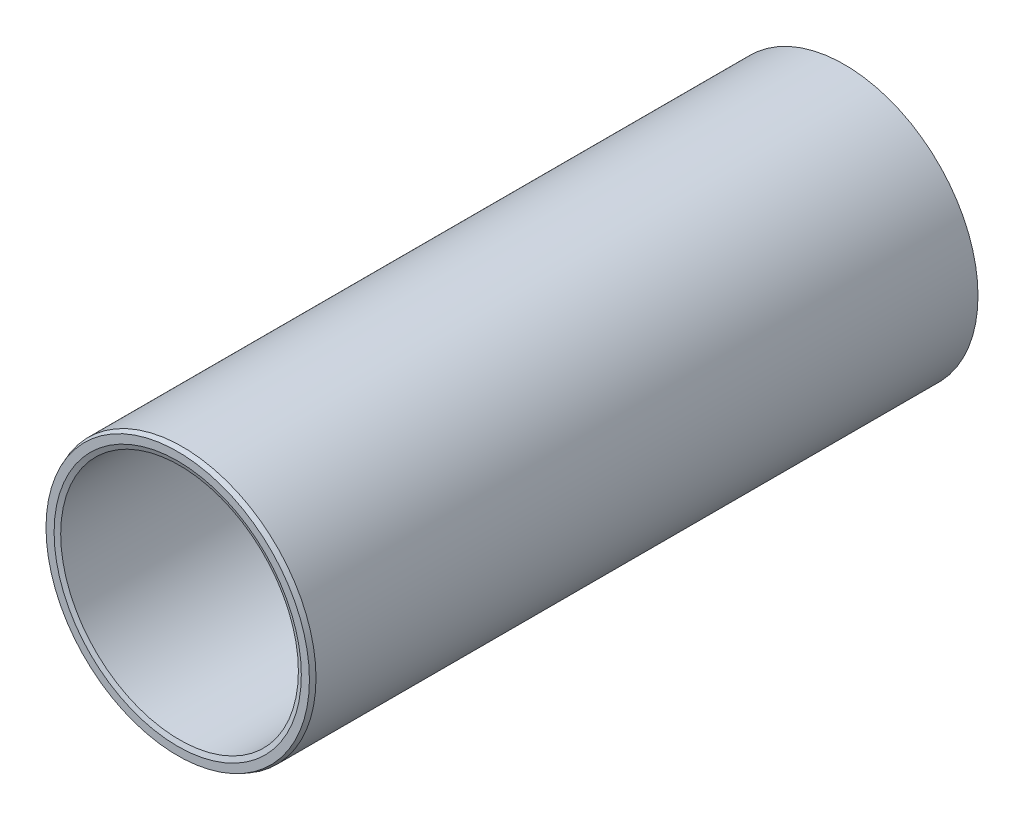
ISO-10303-21;
HEADER;
FILE_DESCRIPTION(('STEP AP214'),'2;1');
FILE_NAME('part.step','',(''),(''),'','','');
FILE_SCHEMA(('AUTOMOTIVE_DESIGN { 1 0 10303 214 1 1 1 1 }'));
ENDSEC;
DATA;
#1=APPLICATION_CONTEXT('core data for automotive mechanical design processes');
#2=APPLICATION_PROTOCOL_DEFINITION('international standard','automotive_design',2000,#1);
#3=PRODUCT_CONTEXT('',#1,'mechanical');
#4=PRODUCT('Part','Part','',(#3));
#5=PRODUCT_RELATED_PRODUCT_CATEGORY('part','',(#4));
#6=PRODUCT_DEFINITION_FORMATION('','',#4);
#7=PRODUCT_DEFINITION_CONTEXT('part definition',#1,'design');
#8=PRODUCT_DEFINITION('design','',#6,#7);
#9=PRODUCT_DEFINITION_SHAPE('','',#8);
#10=(LENGTH_UNIT() NAMED_UNIT(*) SI_UNIT(.MILLI.,.METRE.));
#11=(NAMED_UNIT(*) PLANE_ANGLE_UNIT() SI_UNIT($,.RADIAN.));
#12=(NAMED_UNIT(*) SI_UNIT($,.STERADIAN.) SOLID_ANGLE_UNIT());
#13=UNCERTAINTY_MEASURE_WITH_UNIT(LENGTH_MEASURE(1.E-05),#10,'distance_accuracy_value','');
#14=(GEOMETRIC_REPRESENTATION_CONTEXT(3) GLOBAL_UNCERTAINTY_ASSIGNED_CONTEXT((#13)) GLOBAL_UNIT_ASSIGNED_CONTEXT((#10,
#11,#12)) REPRESENTATION_CONTEXT('',''));
#15=CARTESIAN_POINT('',(0.,0.,0.));
#16=DIRECTION('',(0.,0.,1.));
#17=DIRECTION('',(1.,0.,0.));
#18=AXIS2_PLACEMENT_3D('',#15,#16,#17);
#19=CARTESIAN_POINT('',(0.,0.,5.625));
#20=DIRECTION('',(0.,0.,1.));
#21=DIRECTION('',(1.,0.,0.));
#22=AXIS2_PLACEMENT_3D('',#19,#20,#21);
#23=PLANE('',#22);
#24=CARTESIAN_POINT('',(0.,0.,5.625));
#25=DIRECTION('',(0.,0.,1.));
#26=DIRECTION('',(1.,0.,0.));
#27=AXIS2_PLACEMENT_3D('',#24,#25,#26);
#28=CIRCLE('',#27,1.10814543859859);
#29=CARTESIAN_POINT('',(1.10814543859859,0.,5.625));
#30=VERTEX_POINT('',#29);
#31=EDGE_CURVE('E10',#30,#30,#28,.T.);
#32=ORIENTED_EDGE('',*,*,#31,.T.);
#33=EDGE_LOOP('',(#32));
#34=FACE_BOUND('',#33,.T.);
#35=CARTESIAN_POINT('',(0.,0.,5.625));
#36=DIRECTION('',(0.,0.,1.));
#37=DIRECTION('',(1.,0.,0.));
#38=AXIS2_PLACEMENT_3D('',#35,#36,#37);
#39=CIRCLE('',#38,1.04);
#40=CARTESIAN_POINT('',(1.04,0.,5.625));
#41=VERTEX_POINT('',#40);
#42=EDGE_CURVE('E38',#41,#41,#39,.F.);
#43=ORIENTED_EDGE('',*,*,#42,.T.);
#44=EDGE_LOOP('',(#43));
#45=FACE_BOUND('',#44,.T.);
#46=ADVANCED_FACE('F31',(#34,#45),#23,.T.);
#47=CARTESIAN_POINT('',(0.,0.,0.));
#48=DIRECTION('',(0.,0.,1.));
#49=DIRECTION('',(1.,0.,0.));
#50=AXIS2_PLACEMENT_3D('',#47,#48,#49);
#51=PLANE('',#50);
#52=CARTESIAN_POINT('',(0.,0.,0.));
#53=DIRECTION('',(0.,0.,1.));
#54=DIRECTION('',(1.,0.,0.));
#55=AXIS2_PLACEMENT_3D('',#52,#53,#54);
#56=CIRCLE('',#55,1.0835);
#57=CARTESIAN_POINT('',(1.0835,0.,0.));
#58=VERTEX_POINT('',#57);
#59=EDGE_CURVE('E51',#58,#58,#56,.F.);
#60=ORIENTED_EDGE('',*,*,#59,.T.);
#61=EDGE_LOOP('',(#60));
#62=FACE_BOUND('',#61,.T.);
#63=CARTESIAN_POINT('',(0.,0.,0.));
#64=DIRECTION('',(0.,0.,1.));
#65=DIRECTION('',(1.,0.,0.));
#66=AXIS2_PLACEMENT_3D('',#63,#64,#65);
#67=CIRCLE('',#66,1.01535456140142);
#68=CARTESIAN_POINT('',(1.01535456140142,0.,0.));
#69=VERTEX_POINT('',#68);
#70=EDGE_CURVE('E54',#69,#69,#67,.T.);
#71=ORIENTED_EDGE('',*,*,#70,.T.);
#72=EDGE_LOOP('',(#71));
#73=FACE_BOUND('',#72,.T.);
#74=ADVANCED_FACE('F79',(#62,#73),#51,.F.);
#75=CARTESIAN_POINT('',(0.,0.,5.625));
#76=DIRECTION('',(0.,0.,-1.));
#77=DIRECTION('',(-1.,0.,0.));
#78=AXIS2_PLACEMENT_3D('',#75,#76,#77);
#79=CYLINDRICAL_SURFACE('',#78,1.1235);
#80=CARTESIAN_POINT('',(0.,0.,0.0153545614014171));
#81=DIRECTION('',(0.,0.,1.));
#82=DIRECTION('',(1.,0.,0.));
#83=AXIS2_PLACEMENT_3D('',#80,#81,#82);
#84=CIRCLE('',#83,1.1235);
#85=CARTESIAN_POINT('',(-1.1235,0.,0.0153545614014162));
#86=VERTEX_POINT('',#85);
#87=EDGE_CURVE('E57',#86,#86,#84,.T.);
#88=CARTESIAN_POINT('',(0.,0.,5.58500000000002));
#89=DIRECTION('',(0.,0.,1.));
#90=DIRECTION('',(1.,0.,0.));
#91=AXIS2_PLACEMENT_3D('',#88,#89,#90);
#92=CIRCLE('',#91,1.1235);
#93=CARTESIAN_POINT('',(-1.1235,0.,5.58500000000001));
#94=VERTEX_POINT('',#93);
#95=EDGE_CURVE('E60',#94,#94,#92,.F.);
#96=CARTESIAN_POINT('',(-1.1235,0.,0.0153545614014162));
#97=CARTESIAN_POINT('',(-1.1235,0.,0.0733717013868181));
#98=CARTESIAN_POINT('',(-1.1235,0.,0.13138884137222));
#99=CARTESIAN_POINT('',(-1.1235,0.,0.247423121343024));
#100=CARTESIAN_POINT('',(-1.1235,0.,0.305440261328426));
#101=CARTESIAN_POINT('',(-1.1235,0.,0.421474541299231));
#102=CARTESIAN_POINT('',(-1.1235,0.,0.479491681284633));
#103=CARTESIAN_POINT('',(-1.1235,0.,0.595525961255437));
#104=CARTESIAN_POINT('',(-1.1235,0.,0.653543101240839));
#105=CARTESIAN_POINT('',(-1.1235,0.,0.769577381211643));
#106=CARTESIAN_POINT('',(-1.1235,0.,0.827594521197045));
#107=CARTESIAN_POINT('',(-1.1235,0.,0.943628801167849));
#108=CARTESIAN_POINT('',(-1.1235,0.,1.00164594115325));
#109=CARTESIAN_POINT('',(-1.1235,0.,1.11768022112406));
#110=CARTESIAN_POINT('',(-1.1235,0.,1.17569736110946));
#111=CARTESIAN_POINT('',(-1.1235,0.,1.29173164108026));
#112=CARTESIAN_POINT('',(-1.1235,0.,1.34974878106566));
#113=CARTESIAN_POINT('',(-1.1235,0.,1.46578306103647));
#114=CARTESIAN_POINT('',(-1.1235,0.,1.52380020102187));
#115=CARTESIAN_POINT('',(-1.1235,0.,1.63983448099267));
#116=CARTESIAN_POINT('',(-1.1235,0.,1.69785162097808));
#117=CARTESIAN_POINT('',(-1.1235,0.,1.81388590094888));
#118=CARTESIAN_POINT('',(-1.1235,0.,1.87190304093428));
#119=CARTESIAN_POINT('',(-1.1235,0.,1.98793732090509));
#120=CARTESIAN_POINT('',(-1.1235,0.,2.04595446089049));
#121=CARTESIAN_POINT('',(-1.1235,0.,2.16198874086129));
#122=CARTESIAN_POINT('',(-1.1235,0.,2.22000588084669));
#123=CARTESIAN_POINT('',(-1.1235,0.,2.3360401608175));
#124=CARTESIAN_POINT('',(-1.1235,0.,2.3940573008029));
#125=CARTESIAN_POINT('',(-1.1235,0.,2.51009158077371));
#126=CARTESIAN_POINT('',(-1.1235,0.,2.56810872075911));
#127=CARTESIAN_POINT('',(-1.1235,0.,2.68414300072991));
#128=CARTESIAN_POINT('',(-1.1235,0.,2.74216014071531));
#129=CARTESIAN_POINT('',(-1.1235,0.,2.85819442068612));
#130=CARTESIAN_POINT('',(-1.1235,0.,2.91621156067152));
#131=CARTESIAN_POINT('',(-1.1235,0.,3.03224584064232));
#132=CARTESIAN_POINT('',(-1.1235,0.,3.09026298062773));
#133=CARTESIAN_POINT('',(-1.1235,0.,3.20629726059853));
#134=CARTESIAN_POINT('',(-1.1235,0.,3.26431440058393));
#135=CARTESIAN_POINT('',(-1.1235,0.,3.38034868055474));
#136=CARTESIAN_POINT('',(-1.1235,0.,3.43836582054014));
#137=CARTESIAN_POINT('',(-1.1235,0.,3.55440010051094));
#138=CARTESIAN_POINT('',(-1.1235,0.,3.61241724049634));
#139=CARTESIAN_POINT('',(-1.1235,0.,3.72845152046715));
#140=CARTESIAN_POINT('',(-1.1235,0.,3.78646866045255));
#141=CARTESIAN_POINT('',(-1.1235,0.,3.90250294042335));
#142=CARTESIAN_POINT('',(-1.1235,0.,3.96052008040876));
#143=CARTESIAN_POINT('',(-1.1235,0.,4.07655436037956));
#144=CARTESIAN_POINT('',(-1.1235,0.,4.13457150036496));
#145=CARTESIAN_POINT('',(-1.1235,0.,4.25060578033577));
#146=CARTESIAN_POINT('',(-1.1235,0.,4.30862292032117));
#147=CARTESIAN_POINT('',(-1.1235,0.,4.42465720029197));
#148=CARTESIAN_POINT('',(-1.1235,0.,4.48267434027737));
#149=CARTESIAN_POINT('',(-1.1235,0.,4.59870862024818));
#150=CARTESIAN_POINT('',(-1.1235,0.,4.65672576023358));
#151=CARTESIAN_POINT('',(-1.1235,0.,4.77276004020439));
#152=CARTESIAN_POINT('',(-1.1235,0.,4.83077718018979));
#153=CARTESIAN_POINT('',(-1.1235,0.,4.94681146016059));
#154=CARTESIAN_POINT('',(-1.1235,0.,5.00482860014599));
#155=CARTESIAN_POINT('',(-1.1235,0.,5.1208628801168));
#156=CARTESIAN_POINT('',(-1.1235,0.,5.1788800201022));
#157=CARTESIAN_POINT('',(-1.1235,0.,5.294914300073));
#158=CARTESIAN_POINT('',(-1.1235,0.,5.35293144005841));
#159=CARTESIAN_POINT('',(-1.1235,0.,5.46896572002921));
#160=CARTESIAN_POINT('',(-1.1235,0.,5.52698286001461));
#161=CARTESIAN_POINT('',(-1.1235,0.,5.58500000000001));
#162=B_SPLINE_CURVE_WITH_KNOTS('',3,(#96,#97,#98,#99,#100,#101,#102,#103,#104,#105,#106,#107,
#108,#109,#110,#111,#112,#113,#114,#115,#116,#117,#118,#119,#120,#121,#122,#123,#124,#125,#126,
#127,#128,#129,#130,#131,#132,#133,#134,#135,#136,#137,#138,#139,#140,#141,#142,#143,#144,#145,
#146,#147,#148,#149,#150,#151,#152,#153,#154,#155,#156,#157,#158,#159,#160,#161),.UNSPECIFIED.,
.F.,.F.,(4,2,2,2,2,2,2,2,2,2,2,2,2,2,2,2,2,2,2,2,2,2,2,2,2,2,2,2,2,2,2,2,4),(0.,
0.174051419956206,0.348102839912412,0.522154259868618,0.696205679824825,0.870257099781031,
1.04430851973724,1.21835993969344,1.39241135964965,1.56646277960586,1.74051419956206,
1.91456561951827,2.08861703947447,2.26266845943068,2.43671987938689,2.61077129934309,
2.7848227192993,2.95887413925551,3.13292555921171,3.30697697916792,3.48102839912412,
3.65507981908033,3.82913123903654,4.00318265899274,4.17723407894895,4.35128549890516,
4.52533691886136,4.69938833881757,4.87343975877377,5.04749117872998,5.22154259868619,
5.39559401864239,5.5696454385986),.UNSPECIFIED.);
#163=EDGE_CURVE('BSEAM64',#86,#94,#162,.T.);
#164=ORIENTED_EDGE('',*,*,#87,.T.);
#165=ORIENTED_EDGE('',*,*,#95,.T.);
#166=ORIENTED_EDGE('',*,*,#163,.T.);
#167=ORIENTED_EDGE('',*,*,#163,.F.);
#168=EDGE_LOOP('',(#164,#166,#165,#167));
#169=FACE_BOUND('',#168,.T.);
#170=ADVANCED_FACE('F64',(#169),#79,.T.);
#171=CARTESIAN_POINT('',(0.,0.,5.625));
#172=DIRECTION('',(0.,0.,-1.));
#173=DIRECTION('',(-1.,0.,0.));
#174=AXIS2_PLACEMENT_3D('',#171,#172,#173);
#175=CYLINDRICAL_SURFACE('',#174,1.);
#176=CARTESIAN_POINT('',(0.,0.,0.0400000000000001));
#177=DIRECTION('',(0.,0.,1.));
#178=DIRECTION('',(1.,0.,0.));
#179=AXIS2_PLACEMENT_3D('',#176,#177,#178);
#180=CIRCLE('',#179,1.);
#181=CARTESIAN_POINT('',(-1.,0.,0.0399999999999992));
#182=VERTEX_POINT('',#181);
#183=EDGE_CURVE('E42',#182,#182,#180,.F.);
#184=CARTESIAN_POINT('',(0.,0.,5.60964543859858));
#185=DIRECTION('',(0.,0.,1.));
#186=DIRECTION('',(1.,0.,0.));
#187=AXIS2_PLACEMENT_3D('',#184,#185,#186);
#188=CIRCLE('',#187,1.);
#189=CARTESIAN_POINT('',(-1.,0.,5.60964543859858));
#190=VERTEX_POINT('',#189);
#191=EDGE_CURVE('E46',#190,#190,#188,.T.);
#192=CARTESIAN_POINT('',(-1.,0.,0.0399999999999992));
#193=CARTESIAN_POINT('',(-1.,0.,0.0980171399854012));
#194=CARTESIAN_POINT('',(-1.,0.,0.156034279970803));
#195=CARTESIAN_POINT('',(-1.,0.,0.272068559941607));
#196=CARTESIAN_POINT('',(-1.,0.,0.330085699927009));
#197=CARTESIAN_POINT('',(-1.,0.,0.446119979897813));
#198=CARTESIAN_POINT('',(-1.,0.,0.504137119883215));
#199=CARTESIAN_POINT('',(-1.,0.,0.620171399854019));
#200=CARTESIAN_POINT('',(-1.,0.,0.678188539839421));
#201=CARTESIAN_POINT('',(-1.,0.,0.794222819810224));
#202=CARTESIAN_POINT('',(-1.,0.,0.852239959795626));
#203=CARTESIAN_POINT('',(-1.,0.,0.96827423976643));
#204=CARTESIAN_POINT('',(-1.,0.,1.02629137975183));
#205=CARTESIAN_POINT('',(-1.,0.,1.14232565972264));
#206=CARTESIAN_POINT('',(-1.,0.,1.20034279970804));
#207=CARTESIAN_POINT('',(-1.,0.,1.31637707967884));
#208=CARTESIAN_POINT('',(-1.,0.,1.37439421966424));
#209=CARTESIAN_POINT('',(-1.,0.,1.49042849963505));
#210=CARTESIAN_POINT('',(-1.,0.,1.54844563962045));
#211=CARTESIAN_POINT('',(-1.,0.,1.66447991959125));
#212=CARTESIAN_POINT('',(-1.,0.,1.72249705957665));
#213=CARTESIAN_POINT('',(-1.,0.,1.83853133954746));
#214=CARTESIAN_POINT('',(-1.,0.,1.89654847953286));
#215=CARTESIAN_POINT('',(-1.,0.,2.01258275950366));
#216=CARTESIAN_POINT('',(-1.,0.,2.07059989948907));
#217=CARTESIAN_POINT('',(-1.,0.,2.18663417945987));
#218=CARTESIAN_POINT('',(-1.,0.,2.24465131944527));
#219=CARTESIAN_POINT('',(-1.,0.,2.36068559941608));
#220=CARTESIAN_POINT('',(-1.,0.,2.41870273940148));
#221=CARTESIAN_POINT('',(-1.,0.,2.53473701937228));
#222=CARTESIAN_POINT('',(-1.,0.,2.59275415935768));
#223=CARTESIAN_POINT('',(-1.,0.,2.70878843932849));
#224=CARTESIAN_POINT('',(-1.,0.,2.76680557931389));
#225=CARTESIAN_POINT('',(-1.,0.,2.88283985928469));
#226=CARTESIAN_POINT('',(-1.,0.,2.94085699927009));
#227=CARTESIAN_POINT('',(-1.,0.,3.0568912792409));
#228=CARTESIAN_POINT('',(-1.,0.,3.1149084192263));
#229=CARTESIAN_POINT('',(-1.,0.,3.2309426991971));
#230=CARTESIAN_POINT('',(-1.,0.,3.28895983918251));
#231=CARTESIAN_POINT('',(-1.,0.,3.40499411915331));
#232=CARTESIAN_POINT('',(-1.,0.,3.46301125913871));
#233=CARTESIAN_POINT('',(-1.,0.,3.57904553910952));
#234=CARTESIAN_POINT('',(-1.,0.,3.63706267909492));
#235=CARTESIAN_POINT('',(-1.,0.,3.75309695906572));
#236=CARTESIAN_POINT('',(-1.,0.,3.81111409905112));
#237=CARTESIAN_POINT('',(-1.,0.,3.92714837902193));
#238=CARTESIAN_POINT('',(-1.,0.,3.98516551900733));
#239=CARTESIAN_POINT('',(-1.,0.,4.10119979897813));
#240=CARTESIAN_POINT('',(-1.,0.,4.15921693896353));
#241=CARTESIAN_POINT('',(-1.,0.,4.27525121893434));
#242=CARTESIAN_POINT('',(-1.,0.,4.33326835891974));
#243=CARTESIAN_POINT('',(-1.,0.,4.44930263889054));
#244=CARTESIAN_POINT('',(-1.,0.,4.50731977887595));
#245=CARTESIAN_POINT('',(-1.,0.,4.62335405884675));
#246=CARTESIAN_POINT('',(-1.,0.,4.68137119883215));
#247=CARTESIAN_POINT('',(-1.,0.,4.79740547880295));
#248=CARTESIAN_POINT('',(-1.,0.,4.85542261878836));
#249=CARTESIAN_POINT('',(-1.,0.,4.97145689875916));
#250=CARTESIAN_POINT('',(-1.,0.,5.02947403874456));
#251=CARTESIAN_POINT('',(-1.,0.,5.14550831871537));
#252=CARTESIAN_POINT('',(-1.,0.,5.20352545870077));
#253=CARTESIAN_POINT('',(-1.,0.,5.31955973867157));
#254=CARTESIAN_POINT('',(-1.,0.,5.37757687865697));
#255=CARTESIAN_POINT('',(-1.,0.,5.49361115862778));
#256=CARTESIAN_POINT('',(-1.,0.,5.55162829861318));
#257=CARTESIAN_POINT('',(-1.,0.,5.60964543859858));
#258=B_SPLINE_CURVE_WITH_KNOTS('',3,(#192,#193,#194,#195,#196,#197,#198,#199,#200,#201,#202,
#203,#204,#205,#206,#207,#208,#209,#210,#211,#212,#213,#214,#215,#216,#217,#218,#219,#220,#221,
#222,#223,#224,#225,#226,#227,#228,#229,#230,#231,#232,#233,#234,#235,#236,#237,#238,#239,#240,
#241,#242,#243,#244,#245,#246,#247,#248,#249,#250,#251,#252,#253,#254,#255,#256,#257),
.UNSPECIFIED.,.F.,.F.,(4,2,2,2,2,2,2,2,2,2,2,2,2,2,2,2,2,2,2,2,2,2,2,2,2,2,2,2,2,2,2,2,4),(0.,
0.174051419956206,0.348102839912412,0.522154259868617,0.696205679824823,0.870257099781028,
1.04430851973723,1.21835993969344,1.39241135964965,1.56646277960585,1.74051419956206,
1.91456561951826,2.08861703947447,2.26266845943067,2.43671987938688,2.61077129934309,
2.78482271929929,2.9588741392555,3.1329255592117,3.30697697916791,3.48102839912411,
3.65507981908032,3.82913123903653,4.00318265899273,4.17723407894894,4.35128549890514,
4.52533691886135,4.69938833881755,4.87343975877376,5.04749117872997,5.22154259868617,
5.39559401864238,5.56964543859858),.UNSPECIFIED.);
#259=EDGE_CURVE('BSEAM87',#182,#190,#258,.T.);
#260=ORIENTED_EDGE('',*,*,#183,.T.);
#261=ORIENTED_EDGE('',*,*,#191,.T.);
#262=ORIENTED_EDGE('',*,*,#259,.T.);
#263=ORIENTED_EDGE('',*,*,#259,.F.);
#264=EDGE_LOOP('',(#260,#262,#261,#263));
#265=FACE_BOUND('',#264,.T.);
#266=ADVANCED_FACE('F87',(#265),#175,.F.);
#267=CARTESIAN_POINT('',(0.,0.,0.0153545614014171));
#268=DIRECTION('',(0.,0.,1.));
#269=DIRECTION('',(1.,0.,0.));
#270=AXIS2_PLACEMENT_3D('',#267,#268,#269);
#271=CONICAL_SURFACE('',#270,1.1235,1.20427718387609);
#272=ORIENTED_EDGE('',*,*,#59,.F.);
#273=EDGE_LOOP('',(#272));
#274=FACE_BOUND('',#273,.T.);
#275=ORIENTED_EDGE('',*,*,#87,.F.);
#276=EDGE_LOOP('',(#275));
#277=FACE_BOUND('',#276,.T.);
#278=ADVANCED_FACE('F75',(#274,#277),#271,.T.);
#279=CARTESIAN_POINT('',(0.,0.,0.));
#280=DIRECTION('',(0.,0.,-1.));
#281=DIRECTION('',(-1.,0.,0.));
#282=AXIS2_PLACEMENT_3D('',#279,#280,#281);
#283=CONICAL_SURFACE('',#282,1.01535456140142,0.366519142918799);
#284=ORIENTED_EDGE('',*,*,#183,.F.);
#285=EDGE_LOOP('',(#284));
#286=FACE_BOUND('',#285,.T.);
#287=ORIENTED_EDGE('',*,*,#70,.F.);
#288=EDGE_LOOP('',(#287));
#289=FACE_BOUND('',#288,.T.);
#290=ADVANCED_FACE('F69',(#286,#289),#283,.F.);
#291=CARTESIAN_POINT('',(0.,0.,5.625));
#292=DIRECTION('',(0.,0.,-1.));
#293=DIRECTION('',(-1.,0.,0.));
#294=AXIS2_PLACEMENT_3D('',#291,#292,#293);
#295=CONICAL_SURFACE('',#294,1.10814543859859,0.366519142918807);
#296=ORIENTED_EDGE('',*,*,#95,.F.);
#297=EDGE_LOOP('',(#296));
#298=FACE_BOUND('',#297,.T.);
#299=ORIENTED_EDGE('',*,*,#31,.F.);
#300=EDGE_LOOP('',(#299));
#301=FACE_BOUND('',#300,.T.);
#302=ADVANCED_FACE('F66',(#298,#301),#295,.T.);
#303=CARTESIAN_POINT('',(0.,0.,5.60964543859858));
#304=DIRECTION('',(0.,0.,1.));
#305=DIRECTION('',(1.,0.,0.));
#306=AXIS2_PLACEMENT_3D('',#303,#304,#305);
#307=CONICAL_SURFACE('',#306,1.,1.20427718387608);
#308=ORIENTED_EDGE('',*,*,#42,.F.);
#309=EDGE_LOOP('',(#308));
#310=FACE_BOUND('',#309,.T.);
#311=ORIENTED_EDGE('',*,*,#191,.F.);
#312=EDGE_LOOP('',(#311));
#313=FACE_BOUND('',#312,.T.);
#314=ADVANCED_FACE('F33',(#310,#313),#307,.F.);
#315=CLOSED_SHELL('',(#46,#74,#170,#266,#278,#290,#302,#314));
#316=MANIFOLD_SOLID_BREP('B2',#315);
#317=ADVANCED_BREP_SHAPE_REPRESENTATION('',(#18,#316),#14);
#318=SHAPE_DEFINITION_REPRESENTATION(#9,#317);
ENDSEC;
END-ISO-10303-21;
